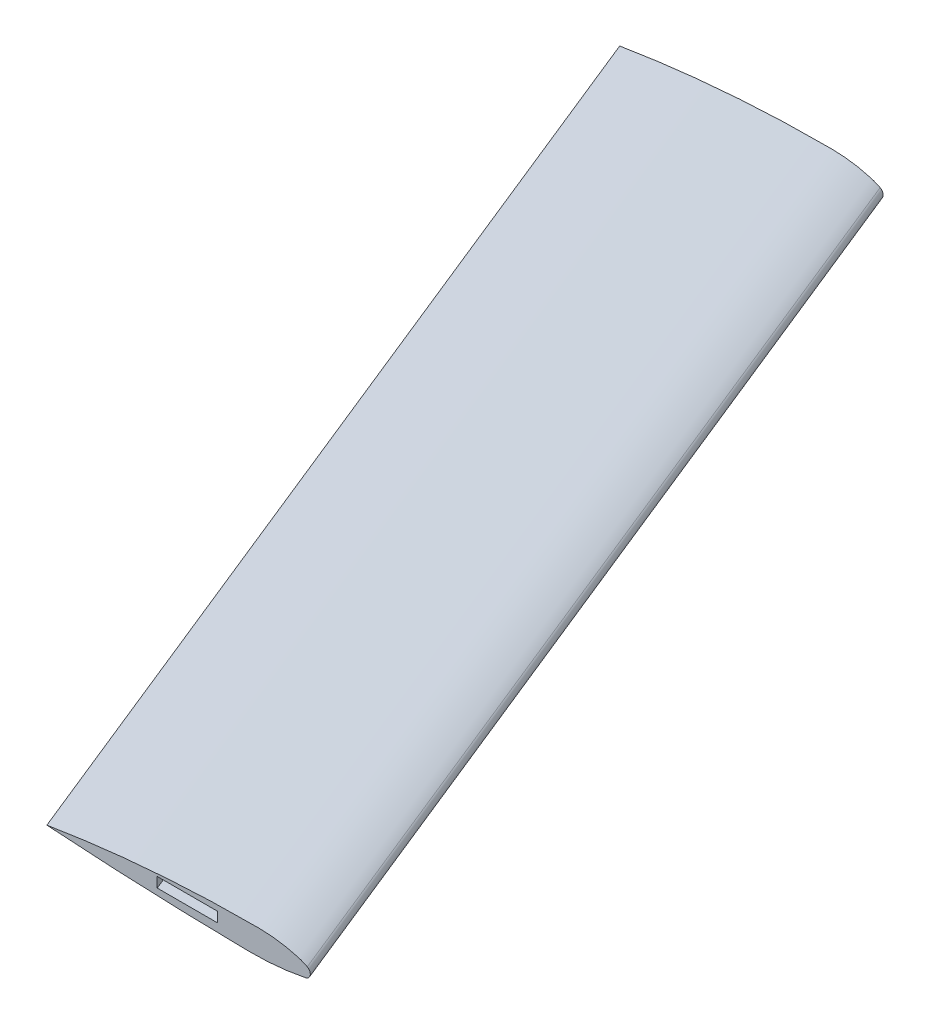
ISO-10303-21;
HEADER;
FILE_DESCRIPTION(('STEP AP214'),'2;1');
FILE_NAME('part.step','',(''),(''),'','','');
FILE_SCHEMA(('AUTOMOTIVE_DESIGN { 1 0 10303 214 1 1 1 1 }'));
ENDSEC;
DATA;
#1=APPLICATION_CONTEXT('core data for automotive mechanical design processes');
#2=APPLICATION_PROTOCOL_DEFINITION('international standard','automotive_design',2000,#1);
#3=PRODUCT_CONTEXT('',#1,'mechanical');
#4=PRODUCT('Part','Part','',(#3));
#5=PRODUCT_RELATED_PRODUCT_CATEGORY('part','',(#4));
#6=PRODUCT_DEFINITION_FORMATION('','',#4);
#7=PRODUCT_DEFINITION_CONTEXT('part definition',#1,'design');
#8=PRODUCT_DEFINITION('design','',#6,#7);
#9=PRODUCT_DEFINITION_SHAPE('','',#8);
#10=(LENGTH_UNIT() NAMED_UNIT(*) SI_UNIT(.MILLI.,.METRE.));
#11=(NAMED_UNIT(*) PLANE_ANGLE_UNIT() SI_UNIT($,.RADIAN.));
#12=(NAMED_UNIT(*) SI_UNIT($,.STERADIAN.) SOLID_ANGLE_UNIT());
#13=UNCERTAINTY_MEASURE_WITH_UNIT(LENGTH_MEASURE(1.E-05),#10,'distance_accuracy_value','');
#14=(GEOMETRIC_REPRESENTATION_CONTEXT(3) GLOBAL_UNCERTAINTY_ASSIGNED_CONTEXT((#13)) GLOBAL_UNIT_ASSIGNED_CONTEXT((#10,
#11,#12)) REPRESENTATION_CONTEXT('',''));
#15=CARTESIAN_POINT('',(0.,0.,0.));
#16=DIRECTION('',(0.,0.,1.));
#17=DIRECTION('',(1.,0.,0.));
#18=AXIS2_PLACEMENT_3D('',#15,#16,#17);
#19=CARTESIAN_POINT('',(-405.020409697345,-106.311961463395,-1092.2));
#20=DIRECTION('',(0.,0.,1.));
#21=DIRECTION('',(1.,0.,0.));
#22=AXIS2_PLACEMENT_3D('',#19,#20,#21);
#23=PLANE('',#22);
#24=DIRECTION('',(0.,1.,0.));
#25=VECTOR('',#24,1.);
#26=CARTESIAN_POINT('',(-520.129656428513,14.097,-1092.2));
#27=LINE('',#26,#25);
#28=CARTESIAN_POINT('',(-520.129656428513,14.097,-1092.2));
#29=VERTEX_POINT('',#28);
#30=CARTESIAN_POINT('',(-520.129656428513,25.527,-1092.2));
#31=VERTEX_POINT('',#30);
#32=EDGE_CURVE('E204',#29,#31,#27,.T.);
#33=ORIENTED_EDGE('',*,*,#32,.F.);
#34=DIRECTION('',(-1.,0.,0.));
#35=VECTOR('',#34,1.);
#36=CARTESIAN_POINT('',(-520.129656428513,14.097,-1092.2));
#37=LINE('',#36,#35);
#38=CARTESIAN_POINT('',(-451.642700268486,14.097,-1092.2));
#39=VERTEX_POINT('',#38);
#40=EDGE_CURVE('E211',#39,#29,#37,.T.);
#41=ORIENTED_EDGE('',*,*,#40,.F.);
#42=DIRECTION('',(0.,1.,0.));
#43=VECTOR('',#42,1.);
#44=CARTESIAN_POINT('',(-451.642700268486,14.097,-1092.2));
#45=LINE('',#44,#43);
#46=CARTESIAN_POINT('',(-451.642700268486,25.527,-1092.2));
#47=VERTEX_POINT('',#46);
#48=EDGE_CURVE('E568',#39,#47,#45,.T.);
#49=ORIENTED_EDGE('',*,*,#48,.T.);
#50=DIRECTION('',(-1.,0.,0.));
#51=VECTOR('',#50,1.);
#52=CARTESIAN_POINT('',(-520.129656428513,25.527,-1092.2));
#53=LINE('',#52,#51);
#54=EDGE_CURVE('E222',#47,#31,#53,.T.);
#55=ORIENTED_EDGE('',*,*,#54,.T.);
#56=EDGE_LOOP('',(#33,#41,#49,#55));
#57=FACE_BOUND('',#56,.T.);
#58=CARTESIAN_POINT('',(-375.48765869508,-20.0425810696087,-1092.2));
#59=DIRECTION('',(0.,0.,1.));
#60=DIRECTION('',(1.,0.,0.));
#61=AXIS2_PLACEMENT_3D('',#58,#59,#60);
#62=ELLIPSE('',#61,52.0544729369289,48.2640668651051);
#63=CARTESIAN_POINT('',(-349.656597619421,21.8600320467453,-1092.2));
#64=VERTEX_POINT('',#63);
#65=CARTESIAN_POINT('',(-359.739577110439,25.9598126997249,-1092.2));
#66=VERTEX_POINT('',#65);
#67=EDGE_CURVE('E318',#64,#66,#62,.T.);
#68=ORIENTED_EDGE('',*,*,#67,.F.);
#69=CARTESIAN_POINT('',(-353.055165161637,16.3468185510675,-1092.2));
#70=DIRECTION('',(0.,0.,1.));
#71=DIRECTION('',(-1.,0.,0.));
#72=AXIS2_PLACEMENT_3D('',#69,#70,#71);
#73=ELLIPSE('',#72,6.84869408304132,6.35);
#74=CARTESIAN_POINT('',(-351.578401419046,10.1458611123359,-1092.2));
#75=VERTEX_POINT('',#74);
#76=EDGE_CURVE('E458',#64,#75,#73,.F.);
#77=ORIENTED_EDGE('',*,*,#76,.T.);
#78=CARTESIAN_POINT('',(-413.099836229002,268.470372395264,-1092.2));
#79=DIRECTION('',(0.,0.,1.));
#80=DIRECTION('',(1.,0.,0.));
#81=AXIS2_PLACEMENT_3D('',#78,#79,#80);
#82=ELLIPSE('',#81,285.323187882039,264.547053137752);
#83=CARTESIAN_POINT('',(-416.997552055502,3.94800461409561,-1092.2));
#84=VERTEX_POINT('',#83);
#85=EDGE_CURVE('E314',#84,#75,#82,.T.);
#86=ORIENTED_EDGE('',*,*,#85,.F.);
#87=CARTESIAN_POINT('',(-375.097020059196,2847.58690276896,-1092.2));
#88=DIRECTION('',(0.,0.,1.));
#89=DIRECTION('',(0.999969321883776,-0.00783296184731892,0.));
#90=AXIS2_PLACEMENT_3D('',#87,#88,#89);
#91=ELLIPSE('',#90,3398.12195786294,2843.92729443399);
#92=CARTESIAN_POINT('',(-645.570996369339,13.291406219897,-1092.2));
#93=VERTEX_POINT('',#92);
#94=EDGE_CURVE('E319',#93,#84,#91,.T.);
#95=ORIENTED_EDGE('',*,*,#94,.F.);
#96=CARTESIAN_POINT('',(-410.785047423502,-1212.20612642052,-1092.2));
#97=DIRECTION('',(0.,0.,1.));
#98=DIRECTION('',(1.,0.,0.));
#99=AXIS2_PLACEMENT_3D('',#96,#97,#98);
#100=ELLIPSE('',#99,1342.43267001044,1244.68189747666);
#101=CARTESIAN_POINT('',(-404.297033786117,32.4612342366972,-1092.2));
#102=VERTEX_POINT('',#101);
#103=EDGE_CURVE('E358',#102,#93,#100,.T.);
#104=ORIENTED_EDGE('',*,*,#103,.F.);
#105=CARTESIAN_POINT('',(-405.020409697345,-106.311961463395,-1092.2));
#106=DIRECTION('',(0.,0.,1.));
#107=DIRECTION('',(1.,0.,0.));
#108=AXIS2_PLACEMENT_3D('',#105,#106,#107);
#109=ELLIPSE('',#108,149.673460972889,138.774816471194);
#110=EDGE_CURVE('E294',#66,#102,#109,.T.);
#111=ORIENTED_EDGE('',*,*,#110,.F.);
#112=EDGE_LOOP('',(#68,#77,#86,#95,#104,#111));
#113=FACE_BOUND('',#112,.T.);
#114=ADVANCED_FACE('F122',(#57,#113),#23,.F.);
#115=CARTESIAN_POINT('',(36.2563303026578,-106.311961463395,0.));
#116=DIRECTION('',(0.,0.,1.));
#117=DIRECTION('',(1.,0.,0.));
#118=AXIS2_PLACEMENT_3D('',#115,#116,#117);
#119=PLANE('',#118);
#120=DIRECTION('',(1.,0.,0.));
#121=VECTOR('',#120,1.);
#122=CARTESIAN_POINT('',(-10.365256411322,14.097,0.));
#123=LINE('',#122,#121);
#124=CARTESIAN_POINT('',(-78.8522125713488,14.097,0.));
#125=VERTEX_POINT('',#124);
#126=CARTESIAN_POINT('',(-10.365256411322,14.097,0.));
#127=VERTEX_POINT('',#126);
#128=EDGE_CURVE('E210',#125,#127,#123,.T.);
#129=ORIENTED_EDGE('',*,*,#128,.F.);
#130=DIRECTION('',(0.,1.,0.));
#131=VECTOR('',#130,1.);
#132=CARTESIAN_POINT('',(-78.8522125713488,14.097,0.));
#133=LINE('',#132,#131);
#134=CARTESIAN_POINT('',(-78.8522125713488,25.527,0.));
#135=VERTEX_POINT('',#134);
#136=EDGE_CURVE('E207',#125,#135,#133,.T.);
#137=ORIENTED_EDGE('',*,*,#136,.T.);
#138=DIRECTION('',(1.,0.,0.));
#139=VECTOR('',#138,1.);
#140=CARTESIAN_POINT('',(-10.365256411322,25.527,0.));
#141=LINE('',#140,#139);
#142=CARTESIAN_POINT('',(-10.365256411322,25.527,0.));
#143=VERTEX_POINT('',#142);
#144=EDGE_CURVE('E571',#135,#143,#141,.T.);
#145=ORIENTED_EDGE('',*,*,#144,.T.);
#146=DIRECTION('',(0.,1.,0.));
#147=VECTOR('',#146,1.);
#148=CARTESIAN_POINT('',(-10.365256411322,14.097,0.));
#149=LINE('',#148,#147);
#150=EDGE_CURVE('E224',#127,#143,#149,.T.);
#151=ORIENTED_EDGE('',*,*,#150,.F.);
#152=EDGE_LOOP('',(#129,#137,#145,#151));
#153=FACE_BOUND('',#152,.T.);
#154=CARTESIAN_POINT('',(28.1769037710007,268.470372395264,0.));
#155=DIRECTION('',(0.,0.,1.));
#156=DIRECTION('',(1.,0.,0.));
#157=AXIS2_PLACEMENT_3D('',#154,#155,#156);
#158=ELLIPSE('',#157,285.323187882039,264.547053137752);
#159=CARTESIAN_POINT('',(24.2791879445013,3.9480046140925,0.));
#160=VERTEX_POINT('',#159);
#161=CARTESIAN_POINT('',(89.69834003348,10.1458541037797,0.));
#162=VERTEX_POINT('',#161);
#163=EDGE_CURVE('E309',#160,#162,#158,.T.);
#164=ORIENTED_EDGE('',*,*,#163,.T.);
#165=CARTESIAN_POINT('',(88.2215748383678,16.3468185510675,0.));
#166=DIRECTION('',(0.,0.,1.));
#167=DIRECTION('',(-1.,0.,0.));
#168=AXIS2_PLACEMENT_3D('',#165,#166,#167);
#169=ELLIPSE('',#168,6.84869408304132,6.35);
#170=CARTESIAN_POINT('',(91.6201507247673,21.8600477382464,0.));
#171=VERTEX_POINT('',#170);
#172=EDGE_CURVE('E12',#162,#171,#169,.T.);
#173=ORIENTED_EDGE('',*,*,#172,.T.);
#174=CARTESIAN_POINT('',(65.7890813049233,-20.042581069609,0.));
#175=DIRECTION('',(0.,0.,1.));
#176=DIRECTION('',(1.,0.,0.));
#177=AXIS2_PLACEMENT_3D('',#174,#175,#176);
#178=ELLIPSE('',#177,52.0544729369298,48.264066865105);
#179=CARTESIAN_POINT('',(81.5371628895645,25.9598126997247,0.));
#180=VERTEX_POINT('',#179);
#181=EDGE_CURVE('E126',#171,#180,#178,.T.);
#182=ORIENTED_EDGE('',*,*,#181,.T.);
#183=CARTESIAN_POINT('',(36.2563303026578,-106.311961463395,0.));
#184=DIRECTION('',(0.,0.,1.));
#185=DIRECTION('',(1.,0.,0.));
#186=AXIS2_PLACEMENT_3D('',#183,#184,#185);
#187=ELLIPSE('',#186,149.673460972889,138.774816471194);
#188=CARTESIAN_POINT('',(36.9797062138845,32.4612342366976,0.));
#189=VERTEX_POINT('',#188);
#190=EDGE_CURVE('E383',#180,#189,#187,.T.);
#191=ORIENTED_EDGE('',*,*,#190,.T.);
#192=CARTESIAN_POINT('',(30.4916925765012,-1212.20612642052,0.));
#193=DIRECTION('',(0.,0.,1.));
#194=DIRECTION('',(1.,0.,0.));
#195=AXIS2_PLACEMENT_3D('',#192,#193,#194);
#196=ELLIPSE('',#195,1342.43267001044,1244.68189747666);
#197=CARTESIAN_POINT('',(-204.294256369335,13.2914062198952,0.));
#198=VERTEX_POINT('',#197);
#199=EDGE_CURVE('E403',#189,#198,#196,.T.);
#200=ORIENTED_EDGE('',*,*,#199,.T.);
#201=CARTESIAN_POINT('',(66.1797199408075,2847.58690276896,0.));
#202=DIRECTION('',(0.,0.,1.));
#203=DIRECTION('',(0.999969321883776,-0.00783296184731892,0.));
#204=AXIS2_PLACEMENT_3D('',#201,#202,#203);
#205=ELLIPSE('',#204,3398.12195786294,2843.927294434);
#206=EDGE_CURVE('E313',#198,#160,#205,.T.);
#207=ORIENTED_EDGE('',*,*,#206,.T.);
#208=EDGE_LOOP('',(#164,#173,#182,#191,#200,#207));
#209=FACE_BOUND('',#208,.T.);
#210=ADVANCED_FACE('F342',(#153,#209),#119,.T.);
#211=CARTESIAN_POINT('',(24.2791879445013,3.9480046140925,0.));
#212=CARTESIAN_POINT('',(-416.997552055502,3.94800461409517,-1092.2));
#213=CARTESIAN_POINT('',(-52.1815592124826,4.91654565789146,0.));
#214=CARTESIAN_POINT('',(-493.458299212486,4.91654565789368,-1092.2));
#215=CARTESIAN_POINT('',(-128.070307753034,8.01865166633231,0.));
#216=CARTESIAN_POINT('',(-569.347047753037,8.01865166633497,-1092.2));
#217=CARTESIAN_POINT('',(-204.294256369335,13.2914062198952,0.));
#218=CARTESIAN_POINT('',(-645.570996369338,13.2914062198979,-1092.2));
#219=B_SPLINE_SURFACE_WITH_KNOTS('',3,1,((#211,#212),(#213,#214),(#215,#216),(#217,#218)),
.UNSPECIFIED.,.F.,.F.,.F.,(4,4),(2,2),(0.,1.),(0.,1.),.UNSPECIFIED.);
#220=DIRECTION('',(-0.374606079750782,0.,-0.927184062100806));
#221=VECTOR('',#220,1.);
#222=CARTESIAN_POINT('',(-424.932626369337,13.2914062198966,-546.1));
#223=LINE('',#222,#221);
#224=EDGE_CURVE('E374',#198,#93,#223,.T.);
#225=DIRECTION('',(0.374606079750782,0.,0.927184062100806));
#226=VECTOR('',#225,1.);
#227=CARTESIAN_POINT('',(-196.3591820555,3.94800461409384,-546.1));
#228=LINE('',#227,#226);
#229=EDGE_CURVE('E371',#84,#160,#228,.T.);
#230=ORIENTED_EDGE('',*,*,#206,.F.);
#231=ORIENTED_EDGE('',*,*,#224,.T.);
#232=ORIENTED_EDGE('',*,*,#94,.T.);
#233=ORIENTED_EDGE('',*,*,#229,.T.);
#234=EDGE_LOOP('',(#230,#231,#232,#233));
#235=FACE_BOUND('',#234,.T.);
#236=ADVANCED_FACE('F248',(#235),#219,.T.);
#237=CARTESIAN_POINT('',(-204.294256369334,13.291406219897,0.));
#238=CARTESIAN_POINT('',(-645.570996369339,13.291406219897,-1092.2));
#239=CARTESIAN_POINT('',(-184.369512206068,16.5729948319006,0.));
#240=CARTESIAN_POINT('',(-625.646252206072,16.5729948319006,-1092.2));
#241=CARTESIAN_POINT('',(-144.381846874478,22.2970469233992,0.));
#242=CARTESIAN_POINT('',(-585.658586874481,22.2970469233992,-1092.2));
#243=CARTESIAN_POINT('',(-84.0928808529997,28.3577961129315,0.));
#244=CARTESIAN_POINT('',(-525.369620853004,28.3577961129318,-1092.2));
#245=CARTESIAN_POINT('',(-23.6029921881773,31.8877488147466,0.));
#246=CARTESIAN_POINT('',(-464.879732188181,31.8877488147467,-1092.2));
#247=CARTESIAN_POINT('',(16.786735512809,32.5517221116263,0.));
#248=CARTESIAN_POINT('',(-424.490004487194,32.5517221116265,-1092.2));
#249=CARTESIAN_POINT('',(40.7445311666091,32.4443634644624,0.));
#250=CARTESIAN_POINT('',(-400.532208833394,32.4443634644627,-1092.2));
#251=CARTESIAN_POINT('',(48.2730020239182,32.1471592514172,0.));
#252=CARTESIAN_POINT('',(-393.003737976084,32.1471592514174,-1092.2));
#253=CARTESIAN_POINT('',(59.506847478084,30.9120471491535,0.));
#254=CARTESIAN_POINT('',(-381.76989252192,30.9120471491538,-1092.2));
#255=CARTESIAN_POINT('',(70.6262351500064,28.8907943172392,0.));
#256=CARTESIAN_POINT('',(-370.650504849996,28.8907943172394,-1092.2));
#257=CARTESIAN_POINT('',(77.9254542807245,27.0227108474497,0.));
#258=CARTESIAN_POINT('',(-363.351285719279,27.0227108474499,-1092.2));
#259=CARTESIAN_POINT('',(83.5793832108858,25.3588029196259,0.));
#260=CARTESIAN_POINT('',(-357.697356789117,25.3588029196261,-1092.2));
#261=CARTESIAN_POINT('',(87.5941757429644,23.9197561714356,0.));
#262=CARTESIAN_POINT('',(-353.682564257038,23.9197561714358,-1092.2));
#263=CARTESIAN_POINT('',(93.3207247398045,21.0668713918343,0.));
#264=CARTESIAN_POINT('',(-347.956015260199,21.0668713918345,-1092.2));
#265=CARTESIAN_POINT('',(98.6625260073383,17.5448620789614,0.));
#266=CARTESIAN_POINT('',(-342.614213992664,17.5448620789614,-1092.2));
#267=CARTESIAN_POINT('',(101.906485619259,14.7742785920445,0.));
#268=CARTESIAN_POINT('',(-339.370254380744,14.7742785920445,-1092.2));
#269=CARTESIAN_POINT('',(103.43389064888,13.291406219897,0.));
#270=CARTESIAN_POINT('',(-337.842849351123,13.2914062198969,-1092.2));
#271=B_SPLINE_SURFACE_WITH_KNOTS('',3,1,((#237,#238),(#239,#240),(#241,#242),(#243,#244),(#245,
#246),(#247,#248),(#249,#250),(#251,#252),(#253,#254),(#255,#256),(#257,#258),(#259,#260),(#261,
#262),(#263,#264),(#265,#266),(#267,#268),(#269,#270)),.UNSPECIFIED.,.F.,.F.,.F.,(4,1,1,1,2,1,1,
1,2,1,1,1,4),(2,2),(0.,0.193518652711467,0.387037305422934,0.580555958134401,0.774074610845868,
0.81015468362618,0.846234756406491,0.882314829186803,0.918394901967115,0.938796176475336,
0.959197450983557,0.979598725491779,1.),(0.,1.),.UNSPECIFIED.);
#272=DIRECTION('',(-0.374606079750783,0.,-0.927184062100805));
#273=VECTOR('',#272,1.);
#274=CARTESIAN_POINT('',(91.6200506668931,21.8598594039577,0.));
#275=LINE('',#274,#273);
#276=EDGE_CURVE('E457',#171,#64,#275,.T.);
#277=ORIENTED_EDGE('',*,*,#181,.F.);
#278=ORIENTED_EDGE('',*,*,#276,.T.);
#279=ORIENTED_EDGE('',*,*,#67,.T.);
#280=ORIENTED_EDGE('',*,*,#110,.T.);
#281=ORIENTED_EDGE('',*,*,#103,.T.);
#282=ORIENTED_EDGE('',*,*,#224,.F.);
#283=ORIENTED_EDGE('',*,*,#199,.F.);
#284=ORIENTED_EDGE('',*,*,#190,.F.);
#285=EDGE_LOOP('',(#277,#278,#279,#280,#281,#282,#283,#284));
#286=FACE_BOUND('',#285,.T.);
#287=ADVANCED_FACE('F235',(#286),#271,.T.);
#288=CARTESIAN_POINT('',(103.43389064888,13.2914062198967,0.));
#289=CARTESIAN_POINT('',(-337.842849351123,13.2914062198969,-1092.2));
#290=CARTESIAN_POINT('',(77.651903074527,6.75483393441806,0.));
#291=CARTESIAN_POINT('',(-363.624836925476,6.75483393441834,-1092.2));
#292=CARTESIAN_POINT('',(51.0051853944075,3.60946194443507,0.));
#293=CARTESIAN_POINT('',(-390.271554605596,3.60946194443529,-1092.2));
#294=CARTESIAN_POINT('',(24.2791879445013,3.94800461409456,0.));
#295=CARTESIAN_POINT('',(-416.997552055502,3.94800461409478,-1092.2));
#296=B_SPLINE_SURFACE_WITH_KNOTS('',3,1,((#288,#289),(#290,#291),(#292,#293),(#294,#295)),
.UNSPECIFIED.,.F.,.F.,.F.,(4,4),(2,2),(0.,1.),(0.,1.),.UNSPECIFIED.);
#297=DIRECTION('',(-0.374606079750782,0.,-0.927184062100806));
#298=VECTOR('',#297,1.);
#299=CARTESIAN_POINT('',(-351.57846750198,10.1461837410461,-1092.2));
#300=LINE('',#299,#298);
#301=EDGE_CURVE('E133',#75,#162,#300,.F.);
#302=ORIENTED_EDGE('',*,*,#85,.T.);
#303=ORIENTED_EDGE('',*,*,#301,.T.);
#304=ORIENTED_EDGE('',*,*,#163,.F.);
#305=ORIENTED_EDGE('',*,*,#229,.F.);
#306=EDGE_LOOP('',(#302,#303,#304,#305));
#307=FACE_BOUND('',#306,.T.);
#308=ADVANCED_FACE('F247',(#307),#296,.T.);
#309=CARTESIAN_POINT('',(-130.282055219664,16.3468185510675,-540.81632480647));
#310=DIRECTION('',(-0.374606079750783,0.,-0.927184062100805));
#311=DIRECTION('',(-0.927184062100806,0.,0.374606079750783));
#312=AXIS2_PLACEMENT_3D('',#309,#310,#311);
#313=CYLINDRICAL_SURFACE('',#312,6.35);
#314=ORIENTED_EDGE('',*,*,#172,.F.);
#315=ORIENTED_EDGE('',*,*,#301,.F.);
#316=ORIENTED_EDGE('',*,*,#76,.F.);
#317=ORIENTED_EDGE('',*,*,#276,.F.);
#318=EDGE_LOOP('',(#314,#315,#316,#317));
#319=FACE_BOUND('',#318,.T.);
#320=ADVANCED_FACE('F124',(#319),#313,.T.);
#321=CARTESIAN_POINT('',(-451.642700268486,14.097,-1092.2));
#322=DIRECTION('',(0.927183854566786,0.,-0.374606593415916));
#323=DIRECTION('',(-0.374606593415916,0.,-0.927183854566786));
#324=AXIS2_PLACEMENT_3D('',#321,#322,#323);
#325=PLANE('',#324);
#326=DIRECTION('',(-0.374606593415916,0.,-0.927183854566786));
#327=VECTOR('',#326,1.);
#328=CARTESIAN_POINT('',(-451.642700268486,25.527,-1092.2));
#329=LINE('',#328,#327);
#330=EDGE_CURVE('E146',#143,#47,#329,.T.);
#331=ORIENTED_EDGE('',*,*,#330,.T.);
#332=ORIENTED_EDGE('',*,*,#48,.F.);
#333=DIRECTION('',(-0.374606593415916,0.,-0.927183854566786));
#334=VECTOR('',#333,1.);
#335=CARTESIAN_POINT('',(-451.642700268486,14.097,-1092.2));
#336=LINE('',#335,#334);
#337=EDGE_CURVE('E217',#127,#39,#336,.T.);
#338=ORIENTED_EDGE('',*,*,#337,.F.);
#339=ORIENTED_EDGE('',*,*,#150,.T.);
#340=EDGE_LOOP('',(#331,#332,#338,#339));
#341=FACE_BOUND('',#340,.T.);
#342=ADVANCED_FACE('F482',(#341),#325,.F.);
#343=CARTESIAN_POINT('',(-78.8522125713488,14.097,0.));
#344=DIRECTION('',(-0.927183854566786,0.,0.374606593415916));
#345=DIRECTION('',(0.374606593415916,0.,0.927183854566786));
#346=AXIS2_PLACEMENT_3D('',#343,#344,#345);
#347=PLANE('',#346);
#348=DIRECTION('',(0.374606593415916,0.,0.927183854566786));
#349=VECTOR('',#348,1.);
#350=CARTESIAN_POINT('',(-78.8522125713488,25.527,0.));
#351=LINE('',#350,#349);
#352=EDGE_CURVE('E141',#31,#135,#351,.T.);
#353=ORIENTED_EDGE('',*,*,#352,.T.);
#354=ORIENTED_EDGE('',*,*,#136,.F.);
#355=DIRECTION('',(0.374606593415916,0.,0.927183854566786));
#356=VECTOR('',#355,1.);
#357=CARTESIAN_POINT('',(-78.8522125713488,14.097,0.));
#358=LINE('',#357,#356);
#359=EDGE_CURVE('E200',#29,#125,#358,.T.);
#360=ORIENTED_EDGE('',*,*,#359,.F.);
#361=ORIENTED_EDGE('',*,*,#32,.T.);
#362=EDGE_LOOP('',(#353,#354,#360,#361));
#363=FACE_BOUND('',#362,.T.);
#364=ADVANCED_FACE('F202',(#363),#347,.F.);
#365=CARTESIAN_POINT('',(0.,14.097,0.));
#366=DIRECTION('',(0.,-1.,0.));
#367=DIRECTION('',(0.,0.,-1.));
#368=AXIS2_PLACEMENT_3D('',#365,#366,#367);
#369=PLANE('',#368);
#370=ORIENTED_EDGE('',*,*,#40,.T.);
#371=ORIENTED_EDGE('',*,*,#359,.T.);
#372=ORIENTED_EDGE('',*,*,#128,.T.);
#373=ORIENTED_EDGE('',*,*,#337,.T.);
#374=EDGE_LOOP('',(#370,#371,#372,#373));
#375=FACE_BOUND('',#374,.T.);
#376=ADVANCED_FACE('F215',(#375),#369,.F.);
#377=CARTESIAN_POINT('',(0.,25.527,0.));
#378=DIRECTION('',(0.,-1.,0.));
#379=DIRECTION('',(0.,0.,-1.));
#380=AXIS2_PLACEMENT_3D('',#377,#378,#379);
#381=PLANE('',#380);
#382=ORIENTED_EDGE('',*,*,#54,.F.);
#383=ORIENTED_EDGE('',*,*,#330,.F.);
#384=ORIENTED_EDGE('',*,*,#144,.F.);
#385=ORIENTED_EDGE('',*,*,#352,.F.);
#386=EDGE_LOOP('',(#382,#383,#384,#385));
#387=FACE_BOUND('',#386,.T.);
#388=ADVANCED_FACE('F495',(#387),#381,.T.);
#389=CLOSED_SHELL('',(#114,#210,#236,#287,#308,#320,#342,#364,#376,#388));
#390=MANIFOLD_SOLID_BREP('B2',#389);
#391=ADVANCED_BREP_SHAPE_REPRESENTATION('',(#18,#390),#14);
#392=SHAPE_DEFINITION_REPRESENTATION(#9,#391);
ENDSEC;
END-ISO-10303-21;
